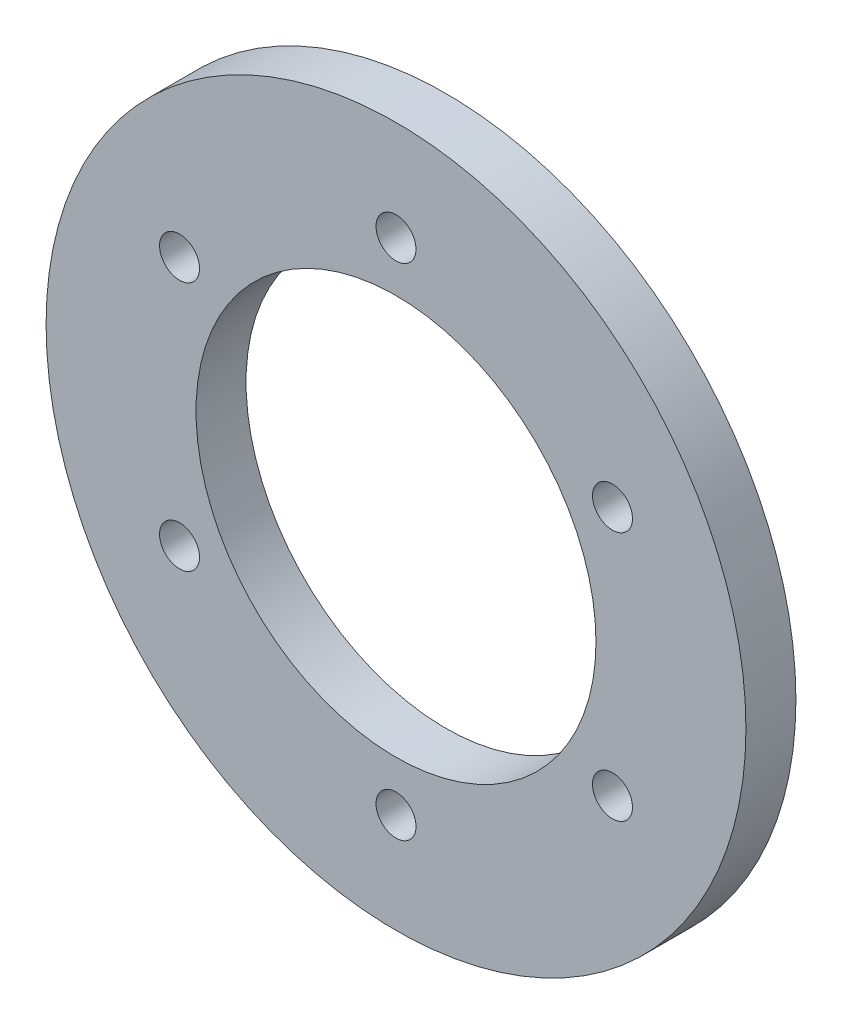
ISO-10303-21;
HEADER;
FILE_DESCRIPTION(('STEP AP214'),'2;1');
FILE_NAME('part.step','',(''),(''),'','','');
FILE_SCHEMA(('AUTOMOTIVE_DESIGN { 1 0 10303 214 1 1 1 1 }'));
ENDSEC;
DATA;
#1=APPLICATION_CONTEXT('core data for automotive mechanical design processes');
#2=APPLICATION_PROTOCOL_DEFINITION('international standard','automotive_design',2000,#1);
#3=PRODUCT_CONTEXT('',#1,'mechanical');
#4=PRODUCT('Part','Part','',(#3));
#5=PRODUCT_RELATED_PRODUCT_CATEGORY('part','',(#4));
#6=PRODUCT_DEFINITION_FORMATION('','',#4);
#7=PRODUCT_DEFINITION_CONTEXT('part definition',#1,'design');
#8=PRODUCT_DEFINITION('design','',#6,#7);
#9=PRODUCT_DEFINITION_SHAPE('','',#8);
#10=(LENGTH_UNIT() NAMED_UNIT(*) SI_UNIT(.MILLI.,.METRE.));
#11=(NAMED_UNIT(*) PLANE_ANGLE_UNIT() SI_UNIT($,.RADIAN.));
#12=(NAMED_UNIT(*) SI_UNIT($,.STERADIAN.) SOLID_ANGLE_UNIT());
#13=UNCERTAINTY_MEASURE_WITH_UNIT(LENGTH_MEASURE(1.E-05),#10,'distance_accuracy_value','');
#14=(GEOMETRIC_REPRESENTATION_CONTEXT(3) GLOBAL_UNCERTAINTY_ASSIGNED_CONTEXT((#13)) GLOBAL_UNIT_ASSIGNED_CONTEXT((#10,
#11,#12)) REPRESENTATION_CONTEXT('',''));
#15=CARTESIAN_POINT('',(0.,0.,0.));
#16=DIRECTION('',(0.,0.,1.));
#17=DIRECTION('',(1.,0.,0.));
#18=AXIS2_PLACEMENT_3D('',#15,#16,#17);
#19=CARTESIAN_POINT('',(0.,0.,5.));
#20=DIRECTION('',(0.,0.,1.));
#21=DIRECTION('',(1.,0.,0.));
#22=AXIS2_PLACEMENT_3D('',#19,#20,#21);
#23=PLANE('',#22);
#24=CARTESIAN_POINT('',(0.,25.,5.));
#25=DIRECTION('',(0.,0.,1.));
#26=DIRECTION('',(1.,0.,0.));
#27=AXIS2_PLACEMENT_3D('',#24,#25,#26);
#28=CIRCLE('',#27,2.);
#29=CARTESIAN_POINT('',(2.,25.,5.));
#30=VERTEX_POINT('',#29);
#31=EDGE_CURVE('E68',#30,#30,#28,.T.);
#32=ORIENTED_EDGE('',*,*,#31,.F.);
#33=EDGE_LOOP('',(#32));
#34=FACE_BOUND('',#33,.T.);
#35=CARTESIAN_POINT('',(-21.650635094611,12.5,5.));
#36=DIRECTION('',(0.,0.,1.));
#37=DIRECTION('',(1.,0.,0.));
#38=AXIS2_PLACEMENT_3D('',#35,#36,#37);
#39=CIRCLE('',#38,2.);
#40=CARTESIAN_POINT('',(-19.650635094611,12.5,5.));
#41=VERTEX_POINT('',#40);
#42=EDGE_CURVE('E69',#41,#41,#39,.T.);
#43=ORIENTED_EDGE('',*,*,#42,.F.);
#44=EDGE_LOOP('',(#43));
#45=FACE_BOUND('',#44,.T.);
#46=CARTESIAN_POINT('',(0.,0.,5.));
#47=DIRECTION('',(0.,0.,1.));
#48=DIRECTION('',(1.,0.,0.));
#49=AXIS2_PLACEMENT_3D('',#46,#47,#48);
#50=CIRCLE('',#49,20.);
#51=CARTESIAN_POINT('',(20.,0.,5.));
#52=VERTEX_POINT('',#51);
#53=EDGE_CURVE('E75',#52,#52,#50,.T.);
#54=ORIENTED_EDGE('',*,*,#53,.F.);
#55=EDGE_LOOP('',(#54));
#56=FACE_BOUND('',#55,.T.);
#57=CARTESIAN_POINT('',(-21.650635094611,-12.5,5.));
#58=DIRECTION('',(0.,0.,1.));
#59=DIRECTION('',(1.,0.,0.));
#60=AXIS2_PLACEMENT_3D('',#57,#58,#59);
#61=CIRCLE('',#60,2.);
#62=CARTESIAN_POINT('',(-19.650635094611,-12.5,5.));
#63=VERTEX_POINT('',#62);
#64=EDGE_CURVE('E43',#63,#63,#61,.T.);
#65=ORIENTED_EDGE('',*,*,#64,.F.);
#66=EDGE_LOOP('',(#65));
#67=FACE_BOUND('',#66,.T.);
#68=CARTESIAN_POINT('',(0.,-25.,5.));
#69=DIRECTION('',(0.,0.,1.));
#70=DIRECTION('',(1.,0.,0.));
#71=AXIS2_PLACEMENT_3D('',#68,#69,#70);
#72=CIRCLE('',#71,2.);
#73=CARTESIAN_POINT('',(2.00000000000001,-25.,5.));
#74=VERTEX_POINT('',#73);
#75=EDGE_CURVE('E50',#74,#74,#72,.T.);
#76=ORIENTED_EDGE('',*,*,#75,.F.);
#77=EDGE_LOOP('',(#76));
#78=FACE_BOUND('',#77,.T.);
#79=CARTESIAN_POINT('',(21.650635094611,-12.5,5.));
#80=DIRECTION('',(0.,0.,1.));
#81=DIRECTION('',(1.,0.,0.));
#82=AXIS2_PLACEMENT_3D('',#79,#80,#81);
#83=CIRCLE('',#82,2.);
#84=CARTESIAN_POINT('',(23.650635094611,-12.5,5.));
#85=VERTEX_POINT('',#84);
#86=EDGE_CURVE('E56',#85,#85,#83,.T.);
#87=ORIENTED_EDGE('',*,*,#86,.F.);
#88=EDGE_LOOP('',(#87));
#89=FACE_BOUND('',#88,.T.);
#90=CARTESIAN_POINT('',(21.650635094611,12.5,5.));
#91=DIRECTION('',(0.,0.,1.));
#92=DIRECTION('',(1.,0.,0.));
#93=AXIS2_PLACEMENT_3D('',#90,#91,#92);
#94=CIRCLE('',#93,2.);
#95=CARTESIAN_POINT('',(23.650635094611,12.5,5.));
#96=VERTEX_POINT('',#95);
#97=EDGE_CURVE('E62',#96,#96,#94,.T.);
#98=ORIENTED_EDGE('',*,*,#97,.F.);
#99=EDGE_LOOP('',(#98));
#100=FACE_BOUND('',#99,.T.);
#101=CARTESIAN_POINT('',(0.,0.,5.));
#102=DIRECTION('',(0.,0.,1.));
#103=DIRECTION('',(1.,0.,0.));
#104=AXIS2_PLACEMENT_3D('',#101,#102,#103);
#105=CIRCLE('',#104,35.);
#106=CARTESIAN_POINT('',(35.,0.,5.));
#107=VERTEX_POINT('',#106);
#108=EDGE_CURVE('E10',#107,#107,#105,.T.);
#109=ORIENTED_EDGE('',*,*,#108,.T.);
#110=EDGE_LOOP('',(#109));
#111=FACE_BOUND('',#110,.T.);
#112=ADVANCED_FACE('F30',(#34,#45,#56,#67,#78,#89,#100,#111),#23,.T.);
#113=CARTESIAN_POINT('',(0.,0.,0.));
#114=DIRECTION('',(0.,0.,1.));
#115=DIRECTION('',(1.,0.,0.));
#116=AXIS2_PLACEMENT_3D('',#113,#114,#115);
#117=PLANE('',#116);
#118=CARTESIAN_POINT('',(0.,25.,0.));
#119=DIRECTION('',(0.,0.,1.));
#120=DIRECTION('',(1.,0.,0.));
#121=AXIS2_PLACEMENT_3D('',#118,#119,#120);
#122=CIRCLE('',#121,2.);
#123=CARTESIAN_POINT('',(2.,25.,0.));
#124=VERTEX_POINT('',#123);
#125=EDGE_CURVE('E41',#124,#124,#122,.T.);
#126=ORIENTED_EDGE('',*,*,#125,.T.);
#127=EDGE_LOOP('',(#126));
#128=FACE_BOUND('',#127,.T.);
#129=CARTESIAN_POINT('',(-21.650635094611,12.5,0.));
#130=DIRECTION('',(0.,0.,1.));
#131=DIRECTION('',(1.,0.,0.));
#132=AXIS2_PLACEMENT_3D('',#129,#130,#131);
#133=CIRCLE('',#132,2.);
#134=CARTESIAN_POINT('',(-19.650635094611,12.5,0.));
#135=VERTEX_POINT('',#134);
#136=EDGE_CURVE('E47',#135,#135,#133,.T.);
#137=ORIENTED_EDGE('',*,*,#136,.T.);
#138=EDGE_LOOP('',(#137));
#139=FACE_BOUND('',#138,.T.);
#140=CARTESIAN_POINT('',(0.,0.,0.));
#141=DIRECTION('',(0.,0.,1.));
#142=DIRECTION('',(1.,0.,0.));
#143=AXIS2_PLACEMENT_3D('',#140,#141,#142);
#144=CIRCLE('',#143,20.);
#145=CARTESIAN_POINT('',(20.,0.,0.));
#146=VERTEX_POINT('',#145);
#147=EDGE_CURVE('E72',#146,#146,#144,.T.);
#148=ORIENTED_EDGE('',*,*,#147,.T.);
#149=EDGE_LOOP('',(#148));
#150=FACE_BOUND('',#149,.T.);
#151=CARTESIAN_POINT('',(-21.650635094611,-12.5,0.));
#152=DIRECTION('',(0.,0.,1.));
#153=DIRECTION('',(1.,0.,0.));
#154=AXIS2_PLACEMENT_3D('',#151,#152,#153);
#155=CIRCLE('',#154,2.);
#156=CARTESIAN_POINT('',(-19.650635094611,-12.5,0.));
#157=VERTEX_POINT('',#156);
#158=EDGE_CURVE('E46',#157,#157,#155,.T.);
#159=ORIENTED_EDGE('',*,*,#158,.T.);
#160=EDGE_LOOP('',(#159));
#161=FACE_BOUND('',#160,.T.);
#162=CARTESIAN_POINT('',(0.,-25.,0.));
#163=DIRECTION('',(0.,0.,1.));
#164=DIRECTION('',(1.,0.,0.));
#165=AXIS2_PLACEMENT_3D('',#162,#163,#164);
#166=CIRCLE('',#165,2.);
#167=CARTESIAN_POINT('',(2.00000000000001,-25.,0.));
#168=VERTEX_POINT('',#167);
#169=EDGE_CURVE('E53',#168,#168,#166,.T.);
#170=ORIENTED_EDGE('',*,*,#169,.T.);
#171=EDGE_LOOP('',(#170));
#172=FACE_BOUND('',#171,.T.);
#173=CARTESIAN_POINT('',(21.650635094611,-12.5,0.));
#174=DIRECTION('',(0.,0.,1.));
#175=DIRECTION('',(1.,0.,0.));
#176=AXIS2_PLACEMENT_3D('',#173,#174,#175);
#177=CIRCLE('',#176,2.);
#178=CARTESIAN_POINT('',(23.650635094611,-12.5,0.));
#179=VERTEX_POINT('',#178);
#180=EDGE_CURVE('E59',#179,#179,#177,.T.);
#181=ORIENTED_EDGE('',*,*,#180,.T.);
#182=EDGE_LOOP('',(#181));
#183=FACE_BOUND('',#182,.T.);
#184=CARTESIAN_POINT('',(21.650635094611,12.5,0.));
#185=DIRECTION('',(0.,0.,1.));
#186=DIRECTION('',(1.,0.,0.));
#187=AXIS2_PLACEMENT_3D('',#184,#185,#186);
#188=CIRCLE('',#187,2.);
#189=CARTESIAN_POINT('',(23.650635094611,12.5,0.));
#190=VERTEX_POINT('',#189);
#191=EDGE_CURVE('E65',#190,#190,#188,.T.);
#192=ORIENTED_EDGE('',*,*,#191,.T.);
#193=EDGE_LOOP('',(#192));
#194=FACE_BOUND('',#193,.T.);
#195=CARTESIAN_POINT('',(0.,0.,0.));
#196=DIRECTION('',(0.,0.,1.));
#197=DIRECTION('',(1.,0.,0.));
#198=AXIS2_PLACEMENT_3D('',#195,#196,#197);
#199=CIRCLE('',#198,35.);
#200=CARTESIAN_POINT('',(35.,0.,0.));
#201=VERTEX_POINT('',#200);
#202=EDGE_CURVE('E34',#201,#201,#199,.T.);
#203=ORIENTED_EDGE('',*,*,#202,.F.);
#204=EDGE_LOOP('',(#203));
#205=FACE_BOUND('',#204,.T.);
#206=ADVANCED_FACE('F85',(#128,#139,#150,#161,#172,#183,#194,#205),#117,.F.);
#207=CARTESIAN_POINT('',(0.,0.,5.));
#208=DIRECTION('',(0.,0.,-1.));
#209=DIRECTION('',(-1.,0.,0.));
#210=AXIS2_PLACEMENT_3D('',#207,#208,#209);
#211=CYLINDRICAL_SURFACE('',#210,35.);
#212=ORIENTED_EDGE('',*,*,#108,.F.);
#213=EDGE_LOOP('',(#212));
#214=FACE_BOUND('',#213,.T.);
#215=ORIENTED_EDGE('',*,*,#202,.T.);
#216=EDGE_LOOP('',(#215));
#217=FACE_BOUND('',#216,.T.);
#218=ADVANCED_FACE('F32',(#214,#217),#211,.T.);
#219=CARTESIAN_POINT('',(21.650635094611,12.5,0.));
#220=DIRECTION('',(0.,0.,1.));
#221=DIRECTION('',(1.,0.,0.));
#222=AXIS2_PLACEMENT_3D('',#219,#220,#221);
#223=CYLINDRICAL_SURFACE('',#222,2.);
#224=ORIENTED_EDGE('',*,*,#191,.F.);
#225=EDGE_LOOP('',(#224));
#226=FACE_BOUND('',#225,.T.);
#227=ORIENTED_EDGE('',*,*,#97,.T.);
#228=EDGE_LOOP('',(#227));
#229=FACE_BOUND('',#228,.T.);
#230=ADVANCED_FACE('F110',(#226,#229),#223,.F.);
#231=CARTESIAN_POINT('',(21.650635094611,-12.5,0.));
#232=DIRECTION('',(0.,0.,1.));
#233=DIRECTION('',(1.,0.,0.));
#234=AXIS2_PLACEMENT_3D('',#231,#232,#233);
#235=CYLINDRICAL_SURFACE('',#234,2.);
#236=ORIENTED_EDGE('',*,*,#180,.F.);
#237=EDGE_LOOP('',(#236));
#238=FACE_BOUND('',#237,.T.);
#239=ORIENTED_EDGE('',*,*,#86,.T.);
#240=EDGE_LOOP('',(#239));
#241=FACE_BOUND('',#240,.T.);
#242=ADVANCED_FACE('F112',(#238,#241),#235,.F.);
#243=CARTESIAN_POINT('',(0.,-25.,0.));
#244=DIRECTION('',(0.,0.,1.));
#245=DIRECTION('',(1.,0.,0.));
#246=AXIS2_PLACEMENT_3D('',#243,#244,#245);
#247=CYLINDRICAL_SURFACE('',#246,2.);
#248=ORIENTED_EDGE('',*,*,#169,.F.);
#249=EDGE_LOOP('',(#248));
#250=FACE_BOUND('',#249,.T.);
#251=ORIENTED_EDGE('',*,*,#75,.T.);
#252=EDGE_LOOP('',(#251));
#253=FACE_BOUND('',#252,.T.);
#254=ADVANCED_FACE('F119',(#250,#253),#247,.F.);
#255=CARTESIAN_POINT('',(-21.650635094611,-12.5,0.));
#256=DIRECTION('',(0.,0.,1.));
#257=DIRECTION('',(1.,0.,0.));
#258=AXIS2_PLACEMENT_3D('',#255,#256,#257);
#259=CYLINDRICAL_SURFACE('',#258,2.);
#260=ORIENTED_EDGE('',*,*,#158,.F.);
#261=EDGE_LOOP('',(#260));
#262=FACE_BOUND('',#261,.T.);
#263=ORIENTED_EDGE('',*,*,#64,.T.);
#264=EDGE_LOOP('',(#263));
#265=FACE_BOUND('',#264,.T.);
#266=ADVANCED_FACE('F129',(#262,#265),#259,.F.);
#267=CARTESIAN_POINT('',(0.,0.,0.));
#268=DIRECTION('',(0.,0.,1.));
#269=DIRECTION('',(1.,0.,0.));
#270=AXIS2_PLACEMENT_3D('',#267,#268,#269);
#271=CYLINDRICAL_SURFACE('',#270,20.);
#272=ORIENTED_EDGE('',*,*,#147,.F.);
#273=EDGE_LOOP('',(#272));
#274=FACE_BOUND('',#273,.T.);
#275=ORIENTED_EDGE('',*,*,#53,.T.);
#276=EDGE_LOOP('',(#275));
#277=FACE_BOUND('',#276,.T.);
#278=ADVANCED_FACE('F132',(#274,#277),#271,.F.);
#279=CARTESIAN_POINT('',(-21.650635094611,12.5,0.));
#280=DIRECTION('',(0.,0.,1.));
#281=DIRECTION('',(1.,0.,0.));
#282=AXIS2_PLACEMENT_3D('',#279,#280,#281);
#283=CYLINDRICAL_SURFACE('',#282,2.);
#284=ORIENTED_EDGE('',*,*,#136,.F.);
#285=EDGE_LOOP('',(#284));
#286=FACE_BOUND('',#285,.T.);
#287=ORIENTED_EDGE('',*,*,#42,.T.);
#288=EDGE_LOOP('',(#287));
#289=FACE_BOUND('',#288,.T.);
#290=ADVANCED_FACE('F91',(#286,#289),#283,.F.);
#291=CARTESIAN_POINT('',(0.,25.,0.));
#292=DIRECTION('',(0.,0.,1.));
#293=DIRECTION('',(1.,0.,0.));
#294=AXIS2_PLACEMENT_3D('',#291,#292,#293);
#295=CYLINDRICAL_SURFACE('',#294,2.);
#296=ORIENTED_EDGE('',*,*,#125,.F.);
#297=EDGE_LOOP('',(#296));
#298=FACE_BOUND('',#297,.T.);
#299=ORIENTED_EDGE('',*,*,#31,.T.);
#300=EDGE_LOOP('',(#299));
#301=FACE_BOUND('',#300,.T.);
#302=ADVANCED_FACE('F88',(#298,#301),#295,.F.);
#303=CLOSED_SHELL('',(#112,#206,#218,#230,#242,#254,#266,#278,#290,#302));
#304=MANIFOLD_SOLID_BREP('B2',#303);
#305=ADVANCED_BREP_SHAPE_REPRESENTATION('',(#18,#304),#14);
#306=SHAPE_DEFINITION_REPRESENTATION(#9,#305);
ENDSEC;
END-ISO-10303-21;
